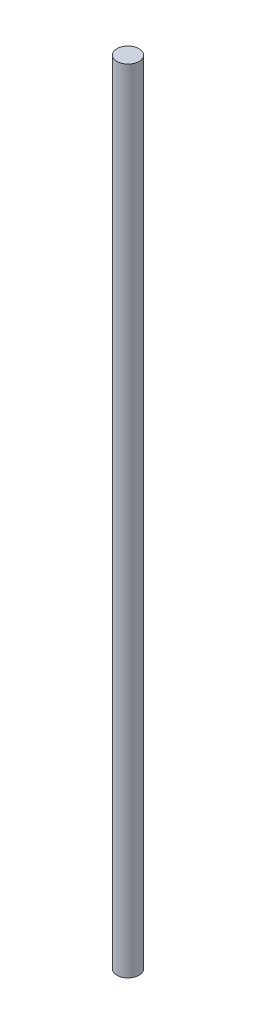
ISO-10303-21;
HEADER;
FILE_DESCRIPTION(('STEP AP214'),'2;1');
FILE_NAME('part.step','',(''),(''),'','','');
FILE_SCHEMA(('AUTOMOTIVE_DESIGN { 1 0 10303 214 1 1 1 1 }'));
ENDSEC;
DATA;
#1=APPLICATION_CONTEXT('core data for automotive mechanical design processes');
#2=APPLICATION_PROTOCOL_DEFINITION('international standard','automotive_design',2000,#1);
#3=PRODUCT_CONTEXT('',#1,'mechanical');
#4=PRODUCT('Part','Part','',(#3));
#5=PRODUCT_RELATED_PRODUCT_CATEGORY('part','',(#4));
#6=PRODUCT_DEFINITION_FORMATION('','',#4);
#7=PRODUCT_DEFINITION_CONTEXT('part definition',#1,'design');
#8=PRODUCT_DEFINITION('design','',#6,#7);
#9=PRODUCT_DEFINITION_SHAPE('','',#8);
#10=(LENGTH_UNIT() NAMED_UNIT(*) SI_UNIT(.MILLI.,.METRE.));
#11=(NAMED_UNIT(*) PLANE_ANGLE_UNIT() SI_UNIT($,.RADIAN.));
#12=(NAMED_UNIT(*) SI_UNIT($,.STERADIAN.) SOLID_ANGLE_UNIT());
#13=UNCERTAINTY_MEASURE_WITH_UNIT(LENGTH_MEASURE(1.E-05),#10,'distance_accuracy_value','');
#14=(GEOMETRIC_REPRESENTATION_CONTEXT(3) GLOBAL_UNCERTAINTY_ASSIGNED_CONTEXT((#13)) GLOBAL_UNIT_ASSIGNED_CONTEXT((#10,
#11,#12)) REPRESENTATION_CONTEXT('',''));
#15=CARTESIAN_POINT('',(0.,0.,0.));
#16=DIRECTION('',(0.,0.,1.));
#17=DIRECTION('',(1.,0.,0.));
#18=AXIS2_PLACEMENT_3D('',#15,#16,#17);
#19=CARTESIAN_POINT('',(0.,357.66,0.));
#20=DIRECTION('',(0.,-1.,0.));
#21=DIRECTION('',(0.,0.,-1.));
#22=AXIS2_PLACEMENT_3D('',#19,#20,#21);
#23=CYLINDRICAL_SURFACE('',#22,5.);
#24=CARTESIAN_POINT('',(0.,357.66,0.));
#25=DIRECTION('',(0.,1.,0.));
#26=DIRECTION('',(0.,0.,1.));
#27=AXIS2_PLACEMENT_3D('',#24,#25,#26);
#28=CIRCLE('',#27,5.);
#29=CARTESIAN_POINT('',(0.,357.66,5.));
#30=VERTEX_POINT('',#29);
#31=EDGE_CURVE('E10',#30,#30,#28,.T.);
#32=ORIENTED_EDGE('',*,*,#31,.F.);
#33=EDGE_LOOP('',(#32));
#34=FACE_BOUND('',#33,.T.);
#35=CARTESIAN_POINT('',(0.,0.,0.));
#36=DIRECTION('',(0.,1.,0.));
#37=DIRECTION('',(0.,0.,1.));
#38=AXIS2_PLACEMENT_3D('',#35,#36,#37);
#39=CIRCLE('',#38,5.);
#40=CARTESIAN_POINT('',(0.,0.,5.));
#41=VERTEX_POINT('',#40);
#42=EDGE_CURVE('E36',#41,#41,#39,.T.);
#43=ORIENTED_EDGE('',*,*,#42,.T.);
#44=EDGE_LOOP('',(#43));
#45=FACE_BOUND('',#44,.T.);
#46=ADVANCED_FACE('F33',(#34,#45),#23,.T.);
#47=CARTESIAN_POINT('',(0.,357.66,0.));
#48=DIRECTION('',(0.,1.,0.));
#49=DIRECTION('',(0.,0.,1.));
#50=AXIS2_PLACEMENT_3D('',#47,#48,#49);
#51=PLANE('',#50);
#52=ORIENTED_EDGE('',*,*,#31,.T.);
#53=EDGE_LOOP('',(#52));
#54=FACE_BOUND('',#53,.T.);
#55=ADVANCED_FACE('F48',(#54),#51,.T.);
#56=CARTESIAN_POINT('',(0.,0.,0.));
#57=DIRECTION('',(0.,1.,0.));
#58=DIRECTION('',(0.,0.,1.));
#59=AXIS2_PLACEMENT_3D('',#56,#57,#58);
#60=PLANE('',#59);
#61=ORIENTED_EDGE('',*,*,#42,.F.);
#62=EDGE_LOOP('',(#61));
#63=FACE_BOUND('',#62,.T.);
#64=ADVANCED_FACE('F46',(#63),#60,.F.);
#65=CLOSED_SHELL('',(#46,#55,#64));
#66=MANIFOLD_SOLID_BREP('B2',#65);
#67=ADVANCED_BREP_SHAPE_REPRESENTATION('',(#18,#66),#14);
#68=SHAPE_DEFINITION_REPRESENTATION(#9,#67);
ENDSEC;
END-ISO-10303-21;
